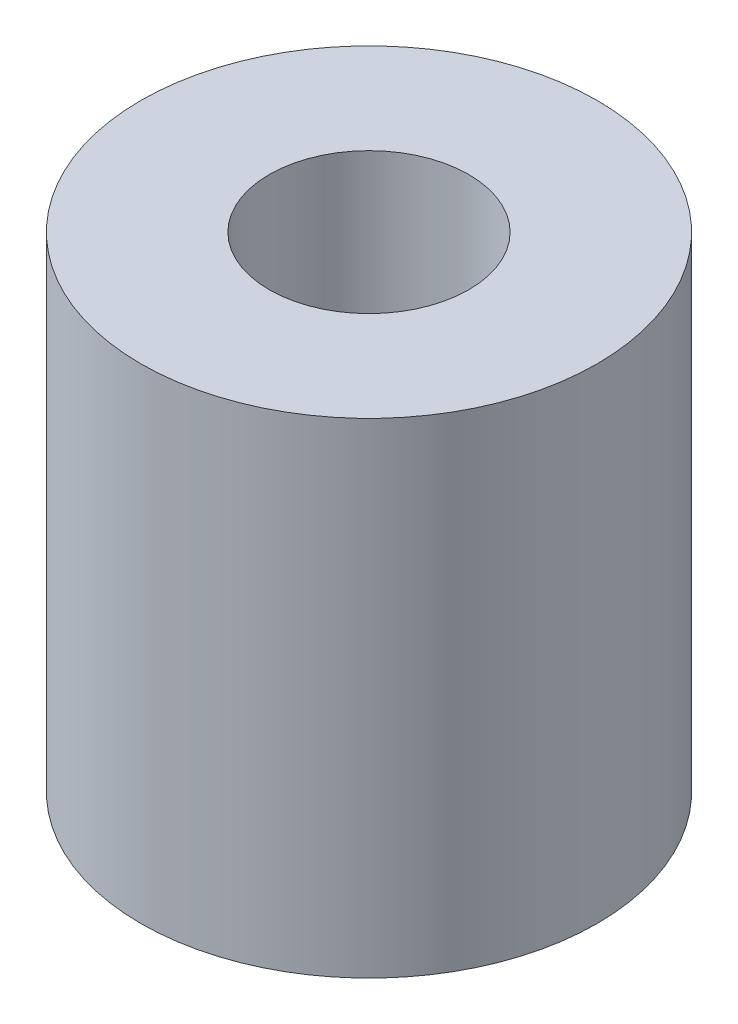
ISO-10303-21;
HEADER;
FILE_DESCRIPTION(('STEP AP214'),'2;1');
FILE_NAME('part.step','',(''),(''),'','','');
FILE_SCHEMA(('AUTOMOTIVE_DESIGN { 1 0 10303 214 1 1 1 1 }'));
ENDSEC;
DATA;
#1=APPLICATION_CONTEXT('core data for automotive mechanical design processes');
#2=APPLICATION_PROTOCOL_DEFINITION('international standard','automotive_design',2000,#1);
#3=PRODUCT_CONTEXT('',#1,'mechanical');
#4=PRODUCT('Part','Part','',(#3));
#5=PRODUCT_RELATED_PRODUCT_CATEGORY('part','',(#4));
#6=PRODUCT_DEFINITION_FORMATION('','',#4);
#7=PRODUCT_DEFINITION_CONTEXT('part definition',#1,'design');
#8=PRODUCT_DEFINITION('design','',#6,#7);
#9=PRODUCT_DEFINITION_SHAPE('','',#8);
#10=(LENGTH_UNIT() NAMED_UNIT(*) SI_UNIT(.MILLI.,.METRE.));
#11=(NAMED_UNIT(*) PLANE_ANGLE_UNIT() SI_UNIT($,.RADIAN.));
#12=(NAMED_UNIT(*) SI_UNIT($,.STERADIAN.) SOLID_ANGLE_UNIT());
#13=UNCERTAINTY_MEASURE_WITH_UNIT(LENGTH_MEASURE(1.E-05),#10,'distance_accuracy_value','');
#14=(GEOMETRIC_REPRESENTATION_CONTEXT(3) GLOBAL_UNCERTAINTY_ASSIGNED_CONTEXT((#13)) GLOBAL_UNIT_ASSIGNED_CONTEXT((#10,
#11,#12)) REPRESENTATION_CONTEXT('',''));
#15=CARTESIAN_POINT('',(0.,0.,0.));
#16=DIRECTION('',(0.,0.,1.));
#17=DIRECTION('',(1.,0.,0.));
#18=AXIS2_PLACEMENT_3D('',#15,#16,#17);
#19=CARTESIAN_POINT('',(0.,8.5,0.));
#20=DIRECTION('',(0.,1.,0.));
#21=DIRECTION('',(0.,0.,1.));
#22=AXIS2_PLACEMENT_3D('',#19,#20,#21);
#23=PLANE('',#22);
#24=CARTESIAN_POINT('',(0.,8.5,0.));
#25=DIRECTION('',(0.,1.,0.));
#26=DIRECTION('',(0.,0.,1.));
#27=AXIS2_PLACEMENT_3D('',#24,#25,#26);
#28=CIRCLE('',#27,4.);
#29=CARTESIAN_POINT('',(0.,8.5,4.));
#30=VERTEX_POINT('',#29);
#31=EDGE_CURVE('E10',#30,#30,#28,.T.);
#32=ORIENTED_EDGE('',*,*,#31,.T.);
#33=EDGE_LOOP('',(#32));
#34=FACE_BOUND('',#33,.T.);
#35=CARTESIAN_POINT('',(0.,8.5,0.));
#36=DIRECTION('',(0.,1.,0.));
#37=DIRECTION('',(0.,0.,1.));
#38=AXIS2_PLACEMENT_3D('',#35,#36,#37);
#39=CIRCLE('',#38,1.75);
#40=CARTESIAN_POINT('',(0.,8.5,1.75));
#41=VERTEX_POINT('',#40);
#42=EDGE_CURVE('E43',#41,#41,#39,.T.);
#43=ORIENTED_EDGE('',*,*,#42,.F.);
#44=EDGE_LOOP('',(#43));
#45=FACE_BOUND('',#44,.T.);
#46=ADVANCED_FACE('F32',(#34,#45),#23,.T.);
#47=CARTESIAN_POINT('',(0.,0.,0.));
#48=DIRECTION('',(0.,1.,0.));
#49=DIRECTION('',(0.,0.,1.));
#50=AXIS2_PLACEMENT_3D('',#47,#48,#49);
#51=PLANE('',#50);
#52=CARTESIAN_POINT('',(0.,0.,0.));
#53=DIRECTION('',(0.,1.,0.));
#54=DIRECTION('',(0.,0.,1.));
#55=AXIS2_PLACEMENT_3D('',#52,#53,#54);
#56=CIRCLE('',#55,4.);
#57=CARTESIAN_POINT('',(0.,0.,4.));
#58=VERTEX_POINT('',#57);
#59=EDGE_CURVE('E36',#58,#58,#56,.T.);
#60=ORIENTED_EDGE('',*,*,#59,.F.);
#61=EDGE_LOOP('',(#60));
#62=FACE_BOUND('',#61,.T.);
#63=CARTESIAN_POINT('',(0.,0.,0.));
#64=DIRECTION('',(0.,1.,0.));
#65=DIRECTION('',(0.,0.,1.));
#66=AXIS2_PLACEMENT_3D('',#63,#64,#65);
#67=CIRCLE('',#66,1.75);
#68=CARTESIAN_POINT('',(0.,0.,1.75));
#69=VERTEX_POINT('',#68);
#70=EDGE_CURVE('E45',#69,#69,#67,.T.);
#71=ORIENTED_EDGE('',*,*,#70,.T.);
#72=EDGE_LOOP('',(#71));
#73=FACE_BOUND('',#72,.T.);
#74=ADVANCED_FACE('F55',(#62,#73),#51,.F.);
#75=CARTESIAN_POINT('',(0.,8.5,0.));
#76=DIRECTION('',(0.,-1.,0.));
#77=DIRECTION('',(0.,0.,-1.));
#78=AXIS2_PLACEMENT_3D('',#75,#76,#77);
#79=CYLINDRICAL_SURFACE('',#78,4.);
#80=ORIENTED_EDGE('',*,*,#31,.F.);
#81=EDGE_LOOP('',(#80));
#82=FACE_BOUND('',#81,.T.);
#83=ORIENTED_EDGE('',*,*,#59,.T.);
#84=EDGE_LOOP('',(#83));
#85=FACE_BOUND('',#84,.T.);
#86=ADVANCED_FACE('F34',(#82,#85),#79,.T.);
#87=CARTESIAN_POINT('',(0.,8.5,0.));
#88=DIRECTION('',(0.,-1.,0.));
#89=DIRECTION('',(0.,0.,-1.));
#90=AXIS2_PLACEMENT_3D('',#87,#88,#89);
#91=CYLINDRICAL_SURFACE('',#90,1.75);
#92=ORIENTED_EDGE('',*,*,#42,.T.);
#93=EDGE_LOOP('',(#92));
#94=FACE_BOUND('',#93,.T.);
#95=ORIENTED_EDGE('',*,*,#70,.F.);
#96=EDGE_LOOP('',(#95));
#97=FACE_BOUND('',#96,.T.);
#98=ADVANCED_FACE('F51',(#94,#97),#91,.F.);
#99=CLOSED_SHELL('',(#46,#74,#86,#98));
#100=MANIFOLD_SOLID_BREP('B2',#99);
#101=ADVANCED_BREP_SHAPE_REPRESENTATION('',(#18,#100),#14);
#102=SHAPE_DEFINITION_REPRESENTATION(#9,#101);
ENDSEC;
END-ISO-10303-21;
